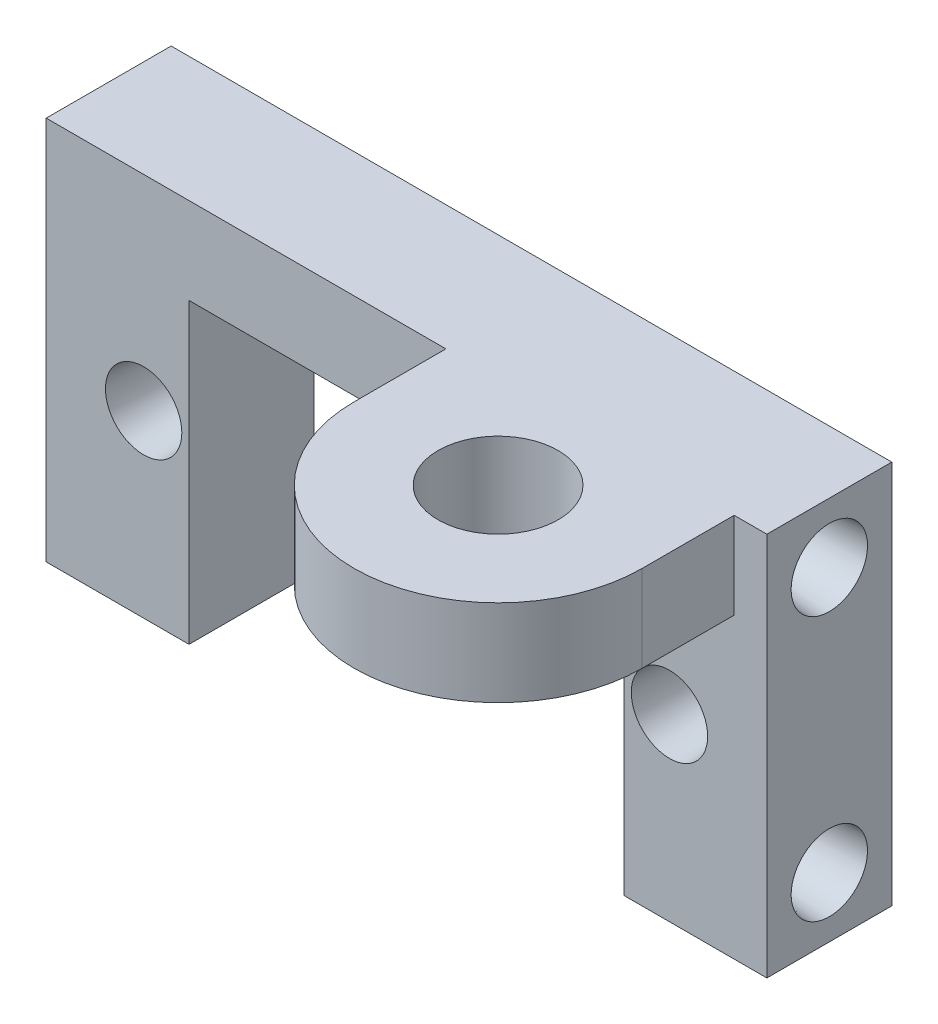
ISO-10303-21;
HEADER;
FILE_DESCRIPTION(('STEP AP214'),'2;1');
FILE_NAME('part.step','',(''),(''),'','','');
FILE_SCHEMA(('AUTOMOTIVE_DESIGN { 1 0 10303 214 1 1 1 1 }'));
ENDSEC;
DATA;
#1=APPLICATION_CONTEXT('core data for automotive mechanical design processes');
#2=APPLICATION_PROTOCOL_DEFINITION('international standard','automotive_design',2000,#1);
#3=PRODUCT_CONTEXT('',#1,'mechanical');
#4=PRODUCT('Part','Part','',(#3));
#5=PRODUCT_RELATED_PRODUCT_CATEGORY('part','',(#4));
#6=PRODUCT_DEFINITION_FORMATION('','',#4);
#7=PRODUCT_DEFINITION_CONTEXT('part definition',#1,'design');
#8=PRODUCT_DEFINITION('design','',#6,#7);
#9=PRODUCT_DEFINITION_SHAPE('','',#8);
#10=(LENGTH_UNIT() NAMED_UNIT(*) SI_UNIT(.MILLI.,.METRE.));
#11=(NAMED_UNIT(*) PLANE_ANGLE_UNIT() SI_UNIT($,.RADIAN.));
#12=(NAMED_UNIT(*) SI_UNIT($,.STERADIAN.) SOLID_ANGLE_UNIT());
#13=UNCERTAINTY_MEASURE_WITH_UNIT(LENGTH_MEASURE(1.E-05),#10,'distance_accuracy_value','');
#14=(GEOMETRIC_REPRESENTATION_CONTEXT(3) GLOBAL_UNCERTAINTY_ASSIGNED_CONTEXT((#13)) GLOBAL_UNIT_ASSIGNED_CONTEXT((#10,
#11,#12)) REPRESENTATION_CONTEXT('',''));
#15=CARTESIAN_POINT('',(0.,0.,0.));
#16=DIRECTION('',(0.,0.,1.));
#17=DIRECTION('',(1.,0.,0.));
#18=AXIS2_PLACEMENT_3D('',#15,#16,#17);
#19=CARTESIAN_POINT('',(0.,0.,6.604));
#20=DIRECTION('',(0.,0.,-1.));
#21=DIRECTION('',(-1.,0.,0.));
#22=AXIS2_PLACEMENT_3D('',#19,#20,#21);
#23=PLANE('',#22);
#24=CARTESIAN_POINT('',(13.9,0.,6.604));
#25=DIRECTION('',(0.,0.,1.));
#26=DIRECTION('',(1.,0.,0.));
#27=AXIS2_PLACEMENT_3D('',#24,#25,#26);
#28=CIRCLE('',#27,2.0193);
#29=CARTESIAN_POINT('',(15.9193,0.,6.604));
#30=VERTEX_POINT('',#29);
#31=EDGE_CURVE('E229',#30,#30,#28,.T.);
#32=ORIENTED_EDGE('',*,*,#31,.F.);
#33=EDGE_LOOP('',(#32));
#34=FACE_BOUND('',#33,.T.);
#35=DIRECTION('',(1.,0.,0.));
#36=VECTOR('',#35,1.);
#37=CARTESIAN_POINT('',(2.08000000000001,6.25,6.604));
#38=LINE('',#37,#36);
#39=CARTESIAN_POINT('',(11.5,6.25,6.604));
#40=VERTEX_POINT('',#39);
#41=CARTESIAN_POINT('',(17.32,6.24999999999999,6.604));
#42=VERTEX_POINT('',#41);
#43=EDGE_CURVE('E11',#40,#42,#38,.T.);
#44=ORIENTED_EDGE('',*,*,#43,.F.);
#45=DIRECTION('',(0.,-1.,0.));
#46=VECTOR('',#45,1.);
#47=CARTESIAN_POINT('',(11.5,6.25,6.604));
#48=LINE('',#47,#46);
#49=CARTESIAN_POINT('',(11.5,-9.498,6.604));
#50=VERTEX_POINT('',#49);
#51=EDGE_CURVE('E169',#40,#50,#48,.T.);
#52=ORIENTED_EDGE('',*,*,#51,.T.);
#53=DIRECTION('',(1.,0.,0.));
#54=VECTOR('',#53,1.);
#55=CARTESIAN_POINT('',(11.5,-9.498,6.604));
#56=LINE('',#55,#54);
#57=CARTESIAN_POINT('',(19.05,-9.498,6.604));
#58=VERTEX_POINT('',#57);
#59=EDGE_CURVE('E171',#50,#58,#56,.T.);
#60=ORIENTED_EDGE('',*,*,#59,.T.);
#61=DIRECTION('',(0.,1.,0.));
#62=VECTOR('',#61,1.);
#63=CARTESIAN_POINT('',(19.05,-9.498,6.604));
#64=LINE('',#63,#62);
#65=CARTESIAN_POINT('',(19.05,10.822,6.604));
#66=VERTEX_POINT('',#65);
#67=EDGE_CURVE('E173',#58,#66,#64,.T.);
#68=ORIENTED_EDGE('',*,*,#67,.T.);
#69=DIRECTION('',(-1.,0.,0.));
#70=VECTOR('',#69,1.);
#71=CARTESIAN_POINT('',(19.05,10.822,6.604));
#72=LINE('',#71,#70);
#73=CARTESIAN_POINT('',(17.32,10.822,6.604));
#74=VERTEX_POINT('',#73);
#75=EDGE_CURVE('E176',#66,#74,#72,.T.);
#76=ORIENTED_EDGE('',*,*,#75,.T.);
#77=DIRECTION('',(0.,1.,0.));
#78=VECTOR('',#77,1.);
#79=CARTESIAN_POINT('',(17.32,-13.4479186717785,6.604));
#80=LINE('',#79,#78);
#81=EDGE_CURVE('E50',#42,#74,#80,.T.);
#82=ORIENTED_EDGE('',*,*,#81,.F.);
#83=EDGE_LOOP('',(#44,#52,#60,#68,#76,#82));
#84=FACE_BOUND('',#83,.T.);
#85=ADVANCED_FACE('F33',(#34,#84),#23,.F.);
#86=CARTESIAN_POINT('',(-11.5,-6.25,6.604));
#87=DIRECTION('',(-1.,0.,0.));
#88=DIRECTION('',(0.,0.,1.));
#89=AXIS2_PLACEMENT_3D('',#86,#87,#88);
#90=PLANE('',#89);
#91=DIRECTION('',(0.,1.,0.));
#92=VECTOR('',#91,1.);
#93=CARTESIAN_POINT('',(-11.5,-6.25,0.));
#94=LINE('',#93,#92);
#95=CARTESIAN_POINT('',(-11.5,-9.498,0.));
#96=VERTEX_POINT('',#95);
#97=CARTESIAN_POINT('',(-11.5,6.25,0.));
#98=VERTEX_POINT('',#97);
#99=EDGE_CURVE('E162',#96,#98,#94,.T.);
#100=ORIENTED_EDGE('',*,*,#99,.T.);
#101=DIRECTION('',(0.,0.,-1.));
#102=VECTOR('',#101,1.);
#103=CARTESIAN_POINT('',(-11.5,6.25,6.604));
#104=LINE('',#103,#102);
#105=CARTESIAN_POINT('',(-11.5,6.25,6.604));
#106=VERTEX_POINT('',#105);
#107=EDGE_CURVE('E42',#106,#98,#104,.T.);
#108=ORIENTED_EDGE('',*,*,#107,.F.);
#109=DIRECTION('',(0.,1.,0.));
#110=VECTOR('',#109,1.);
#111=CARTESIAN_POINT('',(-11.5,-9.498,6.604));
#112=LINE('',#111,#110);
#113=CARTESIAN_POINT('',(-11.5,-9.498,6.604));
#114=VERTEX_POINT('',#113);
#115=EDGE_CURVE('E164',#114,#106,#112,.T.);
#116=ORIENTED_EDGE('',*,*,#115,.F.);
#117=DIRECTION('',(0.,0.,-1.));
#118=VECTOR('',#117,1.);
#119=CARTESIAN_POINT('',(-11.5,-9.498,6.604));
#120=LINE('',#119,#118);
#121=EDGE_CURVE('E182',#114,#96,#120,.T.);
#122=ORIENTED_EDGE('',*,*,#121,.T.);
#123=EDGE_LOOP('',(#100,#108,#116,#122));
#124=FACE_BOUND('',#123,.T.);
#125=ADVANCED_FACE('F35',(#124),#90,.F.);
#126=CARTESIAN_POINT('',(-11.5,6.25,6.604));
#127=DIRECTION('',(0.,1.,0.));
#128=DIRECTION('',(0.,0.,1.));
#129=AXIS2_PLACEMENT_3D('',#126,#127,#128);
#130=PLANE('',#129);
#131=DIRECTION('',(1.,0.,0.));
#132=VECTOR('',#131,1.);
#133=CARTESIAN_POINT('',(-11.5,6.25,0.));
#134=LINE('',#133,#132);
#135=CARTESIAN_POINT('',(11.5,6.25,0.));
#136=VERTEX_POINT('',#135);
#137=EDGE_CURVE('E184',#98,#136,#134,.T.);
#138=ORIENTED_EDGE('',*,*,#137,.T.);
#139=DIRECTION('',(0.,0.,-1.));
#140=VECTOR('',#139,1.);
#141=CARTESIAN_POINT('',(11.5,6.25,6.604));
#142=LINE('',#141,#140);
#143=EDGE_CURVE('E217',#40,#136,#142,.T.);
#144=ORIENTED_EDGE('',*,*,#143,.F.);
#145=ORIENTED_EDGE('',*,*,#43,.T.);
#146=DIRECTION('',(0.,0.,1.));
#147=VECTOR('',#146,1.);
#148=CARTESIAN_POINT('',(17.32,6.25,6.604));
#149=LINE('',#148,#147);
#150=CARTESIAN_POINT('',(17.32,6.25,11.464));
#151=VERTEX_POINT('',#150);
#152=EDGE_CURVE('E163',#42,#151,#149,.T.);
#153=ORIENTED_EDGE('',*,*,#152,.T.);
#154=CARTESIAN_POINT('',(9.70000000000001,6.25,11.464));
#155=DIRECTION('',(0.,1.,0.));
#156=DIRECTION('',(0.,0.,1.));
#157=AXIS2_PLACEMENT_3D('',#154,#155,#156);
#158=CIRCLE('',#157,7.62);
#159=CARTESIAN_POINT('',(2.08000000000001,6.25,11.464));
#160=VERTEX_POINT('',#159);
#161=EDGE_CURVE('E131',#151,#160,#158,.F.);
#162=ORIENTED_EDGE('',*,*,#161,.T.);
#163=DIRECTION('',(0.,0.,-1.));
#164=VECTOR('',#163,1.);
#165=CARTESIAN_POINT('',(2.08000000000001,6.25,11.464));
#166=LINE('',#165,#164);
#167=CARTESIAN_POINT('',(2.08000000000001,6.25,6.604));
#168=VERTEX_POINT('',#167);
#169=EDGE_CURVE('E156',#160,#168,#166,.T.);
#170=ORIENTED_EDGE('',*,*,#169,.T.);
#171=DIRECTION('',(1.,0.,0.));
#172=VECTOR('',#171,1.);
#173=CARTESIAN_POINT('',(-11.5,6.25,6.604));
#174=LINE('',#173,#172);
#175=EDGE_CURVE('E166',#106,#168,#174,.T.);
#176=ORIENTED_EDGE('',*,*,#175,.F.);
#177=ORIENTED_EDGE('',*,*,#107,.T.);
#178=EDGE_LOOP('',(#138,#144,#145,#153,#162,#170,#176,#177));
#179=FACE_BOUND('',#178,.T.);
#180=CARTESIAN_POINT('',(9.70000000000001,6.25,11.464));
#181=DIRECTION('',(0.,1.,0.));
#182=DIRECTION('',(0.,0.,1.));
#183=AXIS2_PLACEMENT_3D('',#180,#181,#182);
#184=CIRCLE('',#183,3.175);
#185=CARTESIAN_POINT('',(6.52500000000001,6.25,11.464));
#186=VERTEX_POINT('',#185);
#187=EDGE_CURVE('E159',#186,#186,#184,.F.);
#188=ORIENTED_EDGE('',*,*,#187,.F.);
#189=EDGE_LOOP('',(#188));
#190=FACE_BOUND('',#189,.T.);
#191=ADVANCED_FACE('F248',(#179,#190),#130,.F.);
#192=CARTESIAN_POINT('',(11.5,-6.25,6.604));
#193=DIRECTION('',(1.,0.,0.));
#194=DIRECTION('',(0.,0.,-1.));
#195=AXIS2_PLACEMENT_3D('',#192,#193,#194);
#196=PLANE('',#195);
#197=DIRECTION('',(0.,-1.,0.));
#198=VECTOR('',#197,1.);
#199=CARTESIAN_POINT('',(11.5,-6.25,0.));
#200=LINE('',#199,#198);
#201=CARTESIAN_POINT('',(11.5,-9.498,0.));
#202=VERTEX_POINT('',#201);
#203=EDGE_CURVE('E187',#136,#202,#200,.T.);
#204=ORIENTED_EDGE('',*,*,#203,.T.);
#205=DIRECTION('',(0.,0.,-1.));
#206=VECTOR('',#205,1.);
#207=CARTESIAN_POINT('',(11.5,-9.498,6.604));
#208=LINE('',#207,#206);
#209=EDGE_CURVE('E214',#50,#202,#208,.T.);
#210=ORIENTED_EDGE('',*,*,#209,.F.);
#211=ORIENTED_EDGE('',*,*,#51,.F.);
#212=ORIENTED_EDGE('',*,*,#143,.T.);
#213=EDGE_LOOP('',(#204,#210,#211,#212));
#214=FACE_BOUND('',#213,.T.);
#215=ADVANCED_FACE('F294',(#214),#196,.F.);
#216=CARTESIAN_POINT('',(11.5,-9.498,6.604));
#217=DIRECTION('',(0.,1.,0.));
#218=DIRECTION('',(0.,0.,1.));
#219=AXIS2_PLACEMENT_3D('',#216,#217,#218);
#220=PLANE('',#219);
#221=DIRECTION('',(1.,0.,0.));
#222=VECTOR('',#221,1.);
#223=CARTESIAN_POINT('',(11.5,-9.498,0.));
#224=LINE('',#223,#222);
#225=CARTESIAN_POINT('',(19.05,-9.498,0.));
#226=VERTEX_POINT('',#225);
#227=EDGE_CURVE('E189',#202,#226,#224,.T.);
#228=ORIENTED_EDGE('',*,*,#227,.T.);
#229=DIRECTION('',(0.,0.,-1.));
#230=VECTOR('',#229,1.);
#231=CARTESIAN_POINT('',(19.05,-9.498,6.604));
#232=LINE('',#231,#230);
#233=EDGE_CURVE('E211',#58,#226,#232,.T.);
#234=ORIENTED_EDGE('',*,*,#233,.F.);
#235=ORIENTED_EDGE('',*,*,#59,.F.);
#236=ORIENTED_EDGE('',*,*,#209,.T.);
#237=EDGE_LOOP('',(#228,#234,#235,#236));
#238=FACE_BOUND('',#237,.T.);
#239=ADVANCED_FACE('F298',(#238),#220,.F.);
#240=CARTESIAN_POINT('',(19.05,-6.25,6.604));
#241=DIRECTION('',(-1.,0.,0.));
#242=DIRECTION('',(0.,-1.,0.));
#243=AXIS2_PLACEMENT_3D('',#240,#241,#242);
#244=PLANE('',#243);
#245=CARTESIAN_POINT('',(19.05,7.64699999999999,3.302));
#246=DIRECTION('',(1.,0.,0.));
#247=DIRECTION('',(0.,1.,0.));
#248=AXIS2_PLACEMENT_3D('',#245,#246,#247);
#249=CIRCLE('',#248,2.0193);
#250=CARTESIAN_POINT('',(19.05,9.66629999999999,3.302));
#251=VERTEX_POINT('',#250);
#252=EDGE_CURVE('E488',#251,#251,#249,.T.);
#253=ORIENTED_EDGE('',*,*,#252,.F.);
#254=EDGE_LOOP('',(#253));
#255=FACE_BOUND('',#254,.T.);
#256=CARTESIAN_POINT('',(19.05,-6.32300000000001,3.302));
#257=DIRECTION('',(1.,0.,0.));
#258=DIRECTION('',(0.,1.,0.));
#259=AXIS2_PLACEMENT_3D('',#256,#257,#258);
#260=CIRCLE('',#259,2.0193);
#261=CARTESIAN_POINT('',(19.05,-4.30370000000001,3.302));
#262=VERTEX_POINT('',#261);
#263=EDGE_CURVE('E499',#262,#262,#260,.T.);
#264=ORIENTED_EDGE('',*,*,#263,.F.);
#265=EDGE_LOOP('',(#264));
#266=FACE_BOUND('',#265,.T.);
#267=DIRECTION('',(0.,1.,0.));
#268=VECTOR('',#267,1.);
#269=CARTESIAN_POINT('',(19.05,-6.25,0.));
#270=LINE('',#269,#268);
#271=CARTESIAN_POINT('',(19.05,10.822,0.));
#272=VERTEX_POINT('',#271);
#273=EDGE_CURVE('E192',#226,#272,#270,.T.);
#274=ORIENTED_EDGE('',*,*,#273,.T.);
#275=DIRECTION('',(0.,0.,-1.));
#276=VECTOR('',#275,1.);
#277=CARTESIAN_POINT('',(19.05,10.822,6.604));
#278=LINE('',#277,#276);
#279=EDGE_CURVE('E208',#66,#272,#278,.T.);
#280=ORIENTED_EDGE('',*,*,#279,.F.);
#281=ORIENTED_EDGE('',*,*,#67,.F.);
#282=ORIENTED_EDGE('',*,*,#233,.T.);
#283=EDGE_LOOP('',(#274,#280,#281,#282));
#284=FACE_BOUND('',#283,.T.);
#285=ADVANCED_FACE('F303',(#255,#266,#284),#244,.F.);
#286=CARTESIAN_POINT('',(19.05,10.822,6.604));
#287=DIRECTION('',(0.,-1.,0.));
#288=DIRECTION('',(0.,0.,-1.));
#289=AXIS2_PLACEMENT_3D('',#286,#287,#288);
#290=PLANE('',#289);
#291=DIRECTION('',(-1.,0.,0.));
#292=VECTOR('',#291,1.);
#293=CARTESIAN_POINT('',(19.05,10.822,0.));
#294=LINE('',#293,#292);
#295=CARTESIAN_POINT('',(-19.05,10.822,0.));
#296=VERTEX_POINT('',#295);
#297=EDGE_CURVE('E194',#272,#296,#294,.T.);
#298=ORIENTED_EDGE('',*,*,#297,.T.);
#299=DIRECTION('',(0.,0.,-1.));
#300=VECTOR('',#299,1.);
#301=CARTESIAN_POINT('',(-19.05,10.822,6.604));
#302=LINE('',#301,#300);
#303=CARTESIAN_POINT('',(-19.05,10.822,6.604));
#304=VERTEX_POINT('',#303);
#305=EDGE_CURVE('E205',#304,#296,#302,.T.);
#306=ORIENTED_EDGE('',*,*,#305,.F.);
#307=CARTESIAN_POINT('',(2.08000000000001,10.822,6.604));
#308=VERTEX_POINT('',#307);
#309=EDGE_CURVE('E175',#308,#304,#72,.T.);
#310=ORIENTED_EDGE('',*,*,#309,.F.);
#311=DIRECTION('',(0.,0.,1.));
#312=VECTOR('',#311,1.);
#313=CARTESIAN_POINT('',(2.08000000000001,10.822,11.464));
#314=LINE('',#313,#312);
#315=CARTESIAN_POINT('',(2.08000000000001,10.822,11.464));
#316=VERTEX_POINT('',#315);
#317=EDGE_CURVE('E134',#308,#316,#314,.T.);
#318=ORIENTED_EDGE('',*,*,#317,.T.);
#319=CARTESIAN_POINT('',(9.70000000000001,10.822,11.464));
#320=DIRECTION('',(0.,1.,0.));
#321=DIRECTION('',(-1.,0.,0.));
#322=AXIS2_PLACEMENT_3D('',#319,#320,#321);
#323=CIRCLE('',#322,7.62);
#324=CARTESIAN_POINT('',(17.32,10.822,11.464));
#325=VERTEX_POINT('',#324);
#326=EDGE_CURVE('E129',#316,#325,#323,.T.);
#327=ORIENTED_EDGE('',*,*,#326,.T.);
#328=DIRECTION('',(0.,0.,-1.));
#329=VECTOR('',#328,1.);
#330=CARTESIAN_POINT('',(17.32,10.822,6.604));
#331=LINE('',#330,#329);
#332=EDGE_CURVE('E137',#325,#74,#331,.T.);
#333=ORIENTED_EDGE('',*,*,#332,.T.);
#334=ORIENTED_EDGE('',*,*,#75,.F.);
#335=ORIENTED_EDGE('',*,*,#279,.T.);
#336=EDGE_LOOP('',(#298,#306,#310,#318,#327,#333,#334,#335));
#337=FACE_BOUND('',#336,.T.);
#338=CARTESIAN_POINT('',(9.70000000000001,10.822,11.464));
#339=DIRECTION('',(0.,1.,0.));
#340=DIRECTION('',(-1.,0.,0.));
#341=AXIS2_PLACEMENT_3D('',#338,#339,#340);
#342=CIRCLE('',#341,3.175);
#343=CARTESIAN_POINT('',(6.52500000000001,10.822,11.464));
#344=VERTEX_POINT('',#343);
#345=EDGE_CURVE('E146',#344,#344,#342,.T.);
#346=ORIENTED_EDGE('',*,*,#345,.F.);
#347=EDGE_LOOP('',(#346));
#348=FACE_BOUND('',#347,.T.);
#349=ADVANCED_FACE('F143',(#337,#348),#290,.F.);
#350=CARTESIAN_POINT('',(-19.05,-6.25,6.604));
#351=DIRECTION('',(1.,0.,0.));
#352=DIRECTION('',(0.,0.,-1.));
#353=AXIS2_PLACEMENT_3D('',#350,#351,#352);
#354=PLANE('',#353);
#355=DIRECTION('',(0.,-1.,0.));
#356=VECTOR('',#355,1.);
#357=CARTESIAN_POINT('',(-19.05,-6.25,0.));
#358=LINE('',#357,#356);
#359=CARTESIAN_POINT('',(-19.05,-9.498,0.));
#360=VERTEX_POINT('',#359);
#361=EDGE_CURVE('E196',#296,#360,#358,.T.);
#362=ORIENTED_EDGE('',*,*,#361,.T.);
#363=DIRECTION('',(0.,0.,-1.));
#364=VECTOR('',#363,1.);
#365=CARTESIAN_POINT('',(-19.05,-9.498,6.604));
#366=LINE('',#365,#364);
#367=CARTESIAN_POINT('',(-19.05,-9.498,6.604));
#368=VERTEX_POINT('',#367);
#369=EDGE_CURVE('E202',#368,#360,#366,.T.);
#370=ORIENTED_EDGE('',*,*,#369,.F.);
#371=DIRECTION('',(0.,-1.,0.));
#372=VECTOR('',#371,1.);
#373=CARTESIAN_POINT('',(-19.05,10.822,6.604));
#374=LINE('',#373,#372);
#375=EDGE_CURVE('E178',#304,#368,#374,.T.);
#376=ORIENTED_EDGE('',*,*,#375,.F.);
#377=ORIENTED_EDGE('',*,*,#305,.T.);
#378=EDGE_LOOP('',(#362,#370,#376,#377));
#379=FACE_BOUND('',#378,.T.);
#380=ADVANCED_FACE('F282',(#379),#354,.F.);
#381=CARTESIAN_POINT('',(-19.05,-9.498,6.604));
#382=DIRECTION('',(0.,1.,0.));
#383=DIRECTION('',(0.,0.,1.));
#384=AXIS2_PLACEMENT_3D('',#381,#382,#383);
#385=PLANE('',#384);
#386=DIRECTION('',(1.,0.,0.));
#387=VECTOR('',#386,1.);
#388=CARTESIAN_POINT('',(-19.05,-9.498,0.));
#389=LINE('',#388,#387);
#390=EDGE_CURVE('E167',#360,#96,#389,.T.);
#391=ORIENTED_EDGE('',*,*,#390,.T.);
#392=ORIENTED_EDGE('',*,*,#121,.F.);
#393=DIRECTION('',(1.,0.,0.));
#394=VECTOR('',#393,1.);
#395=CARTESIAN_POINT('',(-19.05,-9.498,6.604));
#396=LINE('',#395,#394);
#397=EDGE_CURVE('E180',#368,#114,#396,.T.);
#398=ORIENTED_EDGE('',*,*,#397,.F.);
#399=ORIENTED_EDGE('',*,*,#369,.T.);
#400=EDGE_LOOP('',(#391,#392,#398,#399));
#401=FACE_BOUND('',#400,.T.);
#402=ADVANCED_FACE('F275',(#401),#385,.F.);
#403=CARTESIAN_POINT('',(-13.9,0.,6.604));
#404=DIRECTION('',(0.,0.,1.));
#405=DIRECTION('',(1.,0.,0.));
#406=AXIS2_PLACEMENT_3D('',#403,#404,#405);
#407=CIRCLE('',#406,2.0193);
#408=CARTESIAN_POINT('',(-11.8807,0.,6.604));
#409=VERTEX_POINT('',#408);
#410=EDGE_CURVE('E223',#409,#409,#407,.T.);
#411=ORIENTED_EDGE('',*,*,#410,.F.);
#412=EDGE_LOOP('',(#411));
#413=FACE_BOUND('',#412,.T.);
#414=ORIENTED_EDGE('',*,*,#175,.T.);
#415=DIRECTION('',(0.,1.,0.));
#416=VECTOR('',#415,1.);
#417=CARTESIAN_POINT('',(2.08000000000001,-13.4479186717785,6.604));
#418=LINE('',#417,#416);
#419=EDGE_CURVE('E57',#168,#308,#418,.T.);
#420=ORIENTED_EDGE('',*,*,#419,.T.);
#421=ORIENTED_EDGE('',*,*,#309,.T.);
#422=ORIENTED_EDGE('',*,*,#375,.T.);
#423=ORIENTED_EDGE('',*,*,#397,.T.);
#424=ORIENTED_EDGE('',*,*,#115,.T.);
#425=EDGE_LOOP('',(#414,#420,#421,#422,#423,#424));
#426=FACE_BOUND('',#425,.T.);
#427=ADVANCED_FACE('F267',(#413,#426),#23,.F.);
#428=CARTESIAN_POINT('',(0.,0.,0.));
#429=DIRECTION('',(0.,0.,-1.));
#430=DIRECTION('',(-1.,0.,0.));
#431=AXIS2_PLACEMENT_3D('',#428,#429,#430);
#432=PLANE('',#431);
#433=CARTESIAN_POINT('',(-13.9,0.,0.));
#434=DIRECTION('',(0.,0.,-1.));
#435=DIRECTION('',(-1.,0.,0.));
#436=AXIS2_PLACEMENT_3D('',#433,#434,#435);
#437=CIRCLE('',#436,1.7907);
#438=CARTESIAN_POINT('',(-15.6907,0.,0.));
#439=VERTEX_POINT('',#438);
#440=EDGE_CURVE('E149',#439,#439,#437,.T.);
#441=ORIENTED_EDGE('',*,*,#440,.F.);
#442=EDGE_LOOP('',(#441));
#443=FACE_BOUND('',#442,.T.);
#444=CARTESIAN_POINT('',(13.9,0.,0.));
#445=DIRECTION('',(0.,0.,-1.));
#446=DIRECTION('',(-1.,0.,0.));
#447=AXIS2_PLACEMENT_3D('',#444,#445,#446);
#448=CIRCLE('',#447,1.7907);
#449=CARTESIAN_POINT('',(12.1093,0.,0.));
#450=VERTEX_POINT('',#449);
#451=EDGE_CURVE('E227',#450,#450,#448,.T.);
#452=ORIENTED_EDGE('',*,*,#451,.F.);
#453=EDGE_LOOP('',(#452));
#454=FACE_BOUND('',#453,.T.);
#455=ORIENTED_EDGE('',*,*,#99,.F.);
#456=ORIENTED_EDGE('',*,*,#390,.F.);
#457=ORIENTED_EDGE('',*,*,#361,.F.);
#458=ORIENTED_EDGE('',*,*,#297,.F.);
#459=ORIENTED_EDGE('',*,*,#273,.F.);
#460=ORIENTED_EDGE('',*,*,#227,.F.);
#461=ORIENTED_EDGE('',*,*,#203,.F.);
#462=ORIENTED_EDGE('',*,*,#137,.F.);
#463=EDGE_LOOP('',(#455,#456,#457,#458,#459,#460,#461,#462));
#464=FACE_BOUND('',#463,.T.);
#465=ADVANCED_FACE('F261',(#443,#454,#464),#432,.T.);
#466=CARTESIAN_POINT('',(17.32,-13.4479186717785,6.604));
#467=DIRECTION('',(1.,0.,0.));
#468=DIRECTION('',(0.,1.,0.));
#469=AXIS2_PLACEMENT_3D('',#466,#467,#468);
#470=PLANE('',#469);
#471=ORIENTED_EDGE('',*,*,#152,.F.);
#472=ORIENTED_EDGE('',*,*,#81,.T.);
#473=ORIENTED_EDGE('',*,*,#332,.F.);
#474=DIRECTION('',(0.,1.,0.));
#475=VECTOR('',#474,1.);
#476=CARTESIAN_POINT('',(17.32,-13.4479186717785,11.464));
#477=LINE('',#476,#475);
#478=EDGE_CURVE('E124',#151,#325,#477,.T.);
#479=ORIENTED_EDGE('',*,*,#478,.F.);
#480=EDGE_LOOP('',(#471,#472,#473,#479));
#481=FACE_BOUND('',#480,.T.);
#482=ADVANCED_FACE('F138',(#481),#470,.T.);
#483=CARTESIAN_POINT('',(2.08000000000001,-13.4479186717785,11.464));
#484=DIRECTION('',(-1.,0.,0.));
#485=DIRECTION('',(0.,-1.,0.));
#486=AXIS2_PLACEMENT_3D('',#483,#484,#485);
#487=PLANE('',#486);
#488=ORIENTED_EDGE('',*,*,#169,.F.);
#489=DIRECTION('',(0.,1.,0.));
#490=VECTOR('',#489,1.);
#491=CARTESIAN_POINT('',(2.08000000000001,-13.4479186717785,11.464));
#492=LINE('',#491,#490);
#493=EDGE_CURVE('E154',#160,#316,#492,.T.);
#494=ORIENTED_EDGE('',*,*,#493,.T.);
#495=ORIENTED_EDGE('',*,*,#317,.F.);
#496=ORIENTED_EDGE('',*,*,#419,.F.);
#497=EDGE_LOOP('',(#488,#494,#495,#496));
#498=FACE_BOUND('',#497,.T.);
#499=ADVANCED_FACE('F252',(#498),#487,.T.);
#500=CARTESIAN_POINT('',(9.70000000000001,-13.4479186717785,11.464));
#501=DIRECTION('',(0.,1.,0.));
#502=DIRECTION('',(-1.,0.,0.));
#503=AXIS2_PLACEMENT_3D('',#500,#501,#502);
#504=CYLINDRICAL_SURFACE('',#503,7.62);
#505=ORIENTED_EDGE('',*,*,#161,.F.);
#506=ORIENTED_EDGE('',*,*,#478,.T.);
#507=ORIENTED_EDGE('',*,*,#326,.F.);
#508=ORIENTED_EDGE('',*,*,#493,.F.);
#509=EDGE_LOOP('',(#505,#506,#507,#508));
#510=FACE_BOUND('',#509,.T.);
#511=ADVANCED_FACE('F126',(#510),#504,.T.);
#512=CARTESIAN_POINT('',(9.70000000000001,-13.4479186717785,11.464));
#513=DIRECTION('',(0.,1.,0.));
#514=DIRECTION('',(-1.,0.,0.));
#515=AXIS2_PLACEMENT_3D('',#512,#513,#514);
#516=CYLINDRICAL_SURFACE('',#515,3.175);
#517=CARTESIAN_POINT('',(6.52500000000001,6.25,11.464));
#518=CARTESIAN_POINT('',(6.52500000000001,6.297625,11.464));
#519=CARTESIAN_POINT('',(6.52500000000001,6.34525,11.464));
#520=CARTESIAN_POINT('',(6.52500000000001,6.4405,11.464));
#521=CARTESIAN_POINT('',(6.52500000000001,6.488125,11.464));
#522=CARTESIAN_POINT('',(6.52500000000001,6.583375,11.464));
#523=CARTESIAN_POINT('',(6.52500000000001,6.631,11.464));
#524=CARTESIAN_POINT('',(6.52500000000001,6.72624999999999,11.464));
#525=CARTESIAN_POINT('',(6.52500000000001,6.773875,11.464));
#526=CARTESIAN_POINT('',(6.52500000000001,6.869125,11.464));
#527=CARTESIAN_POINT('',(6.52500000000001,6.91675,11.464));
#528=CARTESIAN_POINT('',(6.52500000000001,7.012,11.464));
#529=CARTESIAN_POINT('',(6.52500000000001,7.059625,11.464));
#530=CARTESIAN_POINT('',(6.52500000000001,7.154875,11.464));
#531=CARTESIAN_POINT('',(6.52500000000001,7.2025,11.464));
#532=CARTESIAN_POINT('',(6.52500000000001,7.29775,11.464));
#533=CARTESIAN_POINT('',(6.52500000000001,7.345375,11.464));
#534=CARTESIAN_POINT('',(6.52500000000001,7.440625,11.464));
#535=CARTESIAN_POINT('',(6.52500000000001,7.48825,11.464));
#536=CARTESIAN_POINT('',(6.52500000000001,7.5835,11.464));
#537=CARTESIAN_POINT('',(6.52500000000001,7.631125,11.464));
#538=CARTESIAN_POINT('',(6.52500000000001,7.726375,11.464));
#539=CARTESIAN_POINT('',(6.52500000000001,7.774,11.464));
#540=CARTESIAN_POINT('',(6.52500000000001,7.86925,11.464));
#541=CARTESIAN_POINT('',(6.52500000000001,7.916875,11.464));
#542=CARTESIAN_POINT('',(6.52500000000001,8.012125,11.464));
#543=CARTESIAN_POINT('',(6.52500000000001,8.05975,11.464));
#544=CARTESIAN_POINT('',(6.52500000000001,8.155,11.464));
#545=CARTESIAN_POINT('',(6.52500000000001,8.202625,11.464));
#546=CARTESIAN_POINT('',(6.52500000000001,8.297875,11.464));
#547=CARTESIAN_POINT('',(6.52500000000001,8.3455,11.464));
#548=CARTESIAN_POINT('',(6.52500000000001,8.44075,11.464));
#549=CARTESIAN_POINT('',(6.52500000000001,8.488375,11.464));
#550=CARTESIAN_POINT('',(6.52500000000001,8.583625,11.464));
#551=CARTESIAN_POINT('',(6.52500000000001,8.63125,11.464));
#552=CARTESIAN_POINT('',(6.52500000000001,8.7265,11.464));
#553=CARTESIAN_POINT('',(6.52500000000001,8.774125,11.464));
#554=CARTESIAN_POINT('',(6.52500000000001,8.869375,11.464));
#555=CARTESIAN_POINT('',(6.52500000000001,8.917,11.464));
#556=CARTESIAN_POINT('',(6.52500000000001,9.01225,11.464));
#557=CARTESIAN_POINT('',(6.52500000000001,9.05987499999999,11.464));
#558=CARTESIAN_POINT('',(6.52500000000001,9.155125,11.464));
#559=CARTESIAN_POINT('',(6.52500000000001,9.20275,11.464));
#560=CARTESIAN_POINT('',(6.52500000000001,9.298,11.464));
#561=CARTESIAN_POINT('',(6.52500000000001,9.345625,11.464));
#562=CARTESIAN_POINT('',(6.52500000000001,9.440875,11.464));
#563=CARTESIAN_POINT('',(6.52500000000001,9.4885,11.464));
#564=CARTESIAN_POINT('',(6.52500000000001,9.58375,11.464));
#565=CARTESIAN_POINT('',(6.52500000000001,9.631375,11.464));
#566=CARTESIAN_POINT('',(6.52500000000001,9.726625,11.464));
#567=CARTESIAN_POINT('',(6.52500000000001,9.77425,11.464));
#568=CARTESIAN_POINT('',(6.52500000000001,9.8695,11.464));
#569=CARTESIAN_POINT('',(6.52500000000001,9.917125,11.464));
#570=CARTESIAN_POINT('',(6.52500000000001,10.012375,11.464));
#571=CARTESIAN_POINT('',(6.52500000000001,10.06,11.464));
#572=CARTESIAN_POINT('',(6.52500000000001,10.15525,11.464));
#573=CARTESIAN_POINT('',(6.52500000000001,10.202875,11.464));
#574=CARTESIAN_POINT('',(6.52500000000001,10.298125,11.464));
#575=CARTESIAN_POINT('',(6.52500000000001,10.34575,11.464));
#576=CARTESIAN_POINT('',(6.52500000000001,10.441,11.464));
#577=CARTESIAN_POINT('',(6.52500000000001,10.488625,11.464));
#578=CARTESIAN_POINT('',(6.52500000000001,10.583875,11.464));
#579=CARTESIAN_POINT('',(6.52500000000001,10.6315,11.464));
#580=CARTESIAN_POINT('',(6.52500000000001,10.72675,11.464));
#581=CARTESIAN_POINT('',(6.52500000000001,10.774375,11.464));
#582=CARTESIAN_POINT('',(6.52500000000001,10.822,11.464));
#583=B_SPLINE_CURVE_WITH_KNOTS('',3,(#517,#518,#519,#520,#521,#522,#523,#524,#525,#526,#527,
#528,#529,#530,#531,#532,#533,#534,#535,#536,#537,#538,#539,#540,#541,#542,#543,#544,#545,#546,
#547,#548,#549,#550,#551,#552,#553,#554,#555,#556,#557,#558,#559,#560,#561,#562,#563,#564,#565,
#566,#567,#568,#569,#570,#571,#572,#573,#574,#575,#576,#577,#578,#579,#580,#581,#582),
.UNSPECIFIED.,.F.,.F.,(4,2,2,2,2,2,2,2,2,2,2,2,2,2,2,2,2,2,2,2,2,2,2,2,2,2,2,2,2,2,2,2,4),(0.,
0.142875000000001,0.285750000000001,0.428624999999998,0.571499999999999,0.714375,0.85725,
1.000125,1.143,1.285875,1.42875,1.571625,1.7145,1.857375,2.00025,2.143125,2.286,2.428875,
2.57175,2.714625,2.8575,3.000375,3.14325,3.286125,3.429,3.571875,3.71475,3.857625,4.0005,
4.143375,4.28625,4.429125,4.572),.UNSPECIFIED.);
#584=EDGE_CURVE('BSEAM259',#186,#344,#583,.T.);
#585=ORIENTED_EDGE('',*,*,#187,.T.);
#586=ORIENTED_EDGE('',*,*,#345,.T.);
#587=ORIENTED_EDGE('',*,*,#584,.T.);
#588=ORIENTED_EDGE('',*,*,#584,.F.);
#589=EDGE_LOOP('',(#585,#587,#586,#588));
#590=FACE_BOUND('',#589,.T.);
#591=ADVANCED_FACE('F259',(#590),#516,.F.);
#592=CARTESIAN_POINT('',(13.9,0.,19.084));
#593=DIRECTION('',(0.,0.,-1.));
#594=DIRECTION('',(-1.,0.,0.));
#595=AXIS2_PLACEMENT_3D('',#592,#593,#594);
#596=CYLINDRICAL_SURFACE('',#595,1.7907);
#597=CARTESIAN_POINT('',(13.9,0.,3.33486769371567));
#598=DIRECTION('',(0.,0.,1.));
#599=DIRECTION('',(1.,0.,0.));
#600=AXIS2_PLACEMENT_3D('',#597,#598,#599);
#601=CIRCLE('',#600,1.7907);
#602=CARTESIAN_POINT('',(15.6907,0.,3.33486769371567));
#603=VERTEX_POINT('',#602);
#604=EDGE_CURVE('E37',#603,#603,#601,.T.);
#605=ORIENTED_EDGE('',*,*,#604,.T.);
#606=EDGE_LOOP('',(#605));
#607=FACE_BOUND('',#606,.T.);
#608=ORIENTED_EDGE('',*,*,#451,.T.);
#609=EDGE_LOOP('',(#608));
#610=FACE_BOUND('',#609,.T.);
#611=ADVANCED_FACE('F374',(#607,#610),#596,.F.);
#612=CARTESIAN_POINT('',(-13.9,0.,19.084));
#613=DIRECTION('',(0.,0.,-1.));
#614=DIRECTION('',(-1.,0.,0.));
#615=AXIS2_PLACEMENT_3D('',#612,#613,#614);
#616=CYLINDRICAL_SURFACE('',#615,1.7907);
#617=CARTESIAN_POINT('',(-13.9,0.,3.33486769371566));
#618=DIRECTION('',(0.,0.,1.));
#619=DIRECTION('',(1.,0.,0.));
#620=AXIS2_PLACEMENT_3D('',#617,#618,#619);
#621=CIRCLE('',#620,1.7907);
#622=CARTESIAN_POINT('',(-12.1093,0.,3.33486769371566));
#623=VERTEX_POINT('',#622);
#624=EDGE_CURVE('E221',#623,#623,#621,.T.);
#625=ORIENTED_EDGE('',*,*,#624,.T.);
#626=EDGE_LOOP('',(#625));
#627=FACE_BOUND('',#626,.T.);
#628=ORIENTED_EDGE('',*,*,#440,.T.);
#629=EDGE_LOOP('',(#628));
#630=FACE_BOUND('',#629,.T.);
#631=ADVANCED_FACE('F398',(#627,#630),#616,.F.);
#632=CARTESIAN_POINT('',(-13.9,0.,6.604));
#633=DIRECTION('',(0.,0.,1.));
#634=DIRECTION('',(1.,0.,0.));
#635=AXIS2_PLACEMENT_3D('',#632,#633,#634);
#636=CONICAL_SURFACE('',#635,2.0193,0.0698131700797733);
#637=ORIENTED_EDGE('',*,*,#410,.T.);
#638=EDGE_LOOP('',(#637));
#639=FACE_BOUND('',#638,.T.);
#640=ORIENTED_EDGE('',*,*,#624,.F.);
#641=EDGE_LOOP('',(#640));
#642=FACE_BOUND('',#641,.T.);
#643=ADVANCED_FACE('F408',(#639,#642),#636,.F.);
#644=CARTESIAN_POINT('',(13.9,0.,6.604));
#645=DIRECTION('',(0.,0.,1.));
#646=DIRECTION('',(1.,0.,0.));
#647=AXIS2_PLACEMENT_3D('',#644,#645,#646);
#648=CONICAL_SURFACE('',#647,2.0193,0.0698131700797733);
#649=ORIENTED_EDGE('',*,*,#31,.T.);
#650=EDGE_LOOP('',(#649));
#651=FACE_BOUND('',#650,.T.);
#652=ORIENTED_EDGE('',*,*,#604,.F.);
#653=EDGE_LOOP('',(#652));
#654=FACE_BOUND('',#653,.T.);
#655=ADVANCED_FACE('F417',(#651,#654),#648,.F.);
#656=CARTESIAN_POINT('',(19.05,7.64699999999999,3.302));
#657=DIRECTION('',(1.,0.,0.));
#658=DIRECTION('',(0.,1.,0.));
#659=AXIS2_PLACEMENT_3D('',#656,#657,#658);
#660=CONICAL_SURFACE('',#659,2.0193,0.0698131700797733);
#661=ORIENTED_EDGE('',*,*,#252,.T.);
#662=EDGE_LOOP('',(#661));
#663=FACE_BOUND('',#662,.T.);
#664=CARTESIAN_POINT('',(15.7808676937157,7.64699999999999,3.302));
#665=DIRECTION('',(1.,0.,0.));
#666=DIRECTION('',(0.,1.,0.));
#667=AXIS2_PLACEMENT_3D('',#664,#665,#666);
#668=CIRCLE('',#667,1.7907);
#669=CARTESIAN_POINT('',(15.7808676937157,9.43769999999999,3.302));
#670=VERTEX_POINT('',#669);
#671=EDGE_CURVE('E491',#670,#670,#668,.F.);
#672=ORIENTED_EDGE('',*,*,#671,.T.);
#673=EDGE_LOOP('',(#672));
#674=FACE_BOUND('',#673,.T.);
#675=ADVANCED_FACE('F426',(#663,#674),#660,.F.);
#676=CARTESIAN_POINT('',(19.05,-6.32300000000001,3.302));
#677=DIRECTION('',(1.,0.,0.));
#678=DIRECTION('',(0.,1.,0.));
#679=AXIS2_PLACEMENT_3D('',#676,#677,#678);
#680=CONICAL_SURFACE('',#679,2.0193,0.0698131700797733);
#681=ORIENTED_EDGE('',*,*,#263,.T.);
#682=EDGE_LOOP('',(#681));
#683=FACE_BOUND('',#682,.T.);
#684=CARTESIAN_POINT('',(15.7808676937157,-6.32300000000001,3.302));
#685=DIRECTION('',(1.,0.,0.));
#686=DIRECTION('',(0.,1.,0.));
#687=AXIS2_PLACEMENT_3D('',#684,#685,#686);
#688=CIRCLE('',#687,1.7907);
#689=CARTESIAN_POINT('',(15.7808676937157,-4.53230000000001,3.302));
#690=VERTEX_POINT('',#689);
#691=EDGE_CURVE('E494',#690,#690,#688,.F.);
#692=ORIENTED_EDGE('',*,*,#691,.T.);
#693=EDGE_LOOP('',(#692));
#694=FACE_BOUND('',#693,.T.);
#695=ADVANCED_FACE('F452',(#683,#694),#680,.F.);
#696=CARTESIAN_POINT('',(12.446,7.647,3.302));
#697=DIRECTION('',(1.,0.,0.));
#698=DIRECTION('',(0.,1.,0.));
#699=AXIS2_PLACEMENT_3D('',#696,#697,#698);
#700=PLANE('',#699);
#701=CARTESIAN_POINT('',(12.446,7.647,3.302));
#702=DIRECTION('',(1.,0.,0.));
#703=DIRECTION('',(0.,1.,0.));
#704=AXIS2_PLACEMENT_3D('',#701,#702,#703);
#705=CIRCLE('',#704,1.7907);
#706=CARTESIAN_POINT('',(12.446,9.43769999999999,3.302));
#707=VERTEX_POINT('',#706);
#708=EDGE_CURVE('E234',#707,#707,#705,.T.);
#709=ORIENTED_EDGE('',*,*,#708,.T.);
#710=EDGE_LOOP('',(#709));
#711=FACE_BOUND('',#710,.T.);
#712=ADVANCED_FACE('F448',(#711),#700,.T.);
#713=CARTESIAN_POINT('',(12.446,7.647,3.302));
#714=DIRECTION('',(1.,0.,0.));
#715=DIRECTION('',(0.,1.,0.));
#716=AXIS2_PLACEMENT_3D('',#713,#714,#715);
#717=CYLINDRICAL_SURFACE('',#716,1.7907);
#718=CARTESIAN_POINT('',(15.7808676937157,9.43769999999999,3.302));
#719=CARTESIAN_POINT('',(15.7461294885728,9.43769999999999,3.302));
#720=CARTESIAN_POINT('',(15.7113912834299,9.43769999999999,3.302));
#721=CARTESIAN_POINT('',(15.6419148731442,9.43769999999999,3.302));
#722=CARTESIAN_POINT('',(15.6071766680013,9.43769999999999,3.302));
#723=CARTESIAN_POINT('',(15.5377002577156,9.43769999999999,3.302));
#724=CARTESIAN_POINT('',(15.5029620525727,9.43769999999999,3.302));
#725=CARTESIAN_POINT('',(15.4334856422869,9.43769999999999,3.302));
#726=CARTESIAN_POINT('',(15.3987474371441,9.43769999999999,3.302));
#727=CARTESIAN_POINT('',(15.3292710268583,9.43769999999999,3.302));
#728=CARTESIAN_POINT('',(15.2945328217155,9.43769999999999,3.302));
#729=CARTESIAN_POINT('',(15.2250564114297,9.43769999999999,3.302));
#730=CARTESIAN_POINT('',(15.1903182062868,9.43769999999999,3.302));
#731=CARTESIAN_POINT('',(15.1208417960011,9.43769999999999,3.302));
#732=CARTESIAN_POINT('',(15.0861035908582,9.43769999999999,3.302));
#733=CARTESIAN_POINT('',(15.0166271805725,9.43769999999999,3.302));
#734=CARTESIAN_POINT('',(14.9818889754296,9.43769999999999,3.302));
#735=CARTESIAN_POINT('',(14.9124125651439,9.43769999999999,3.302));
#736=CARTESIAN_POINT('',(14.877674360001,9.43769999999999,3.302));
#737=CARTESIAN_POINT('',(14.8081979497153,9.43769999999999,3.302));
#738=CARTESIAN_POINT('',(14.7734597445724,9.43769999999999,3.302));
#739=CARTESIAN_POINT('',(14.7039833342866,9.43769999999999,3.302));
#740=CARTESIAN_POINT('',(14.6692451291438,9.43769999999999,3.302));
#741=CARTESIAN_POINT('',(14.599768718858,9.43769999999999,3.302));
#742=CARTESIAN_POINT('',(14.5650305137152,9.43769999999999,3.302));
#743=CARTESIAN_POINT('',(14.4955541034294,9.43769999999999,3.302));
#744=CARTESIAN_POINT('',(14.4608158982865,9.43769999999999,3.302));
#745=CARTESIAN_POINT('',(14.3913394880008,9.43769999999999,3.302));
#746=CARTESIAN_POINT('',(14.3566012828579,9.43769999999999,3.302));
#747=CARTESIAN_POINT('',(14.2871248725722,9.43769999999999,3.302));
#748=CARTESIAN_POINT('',(14.2523866674293,9.43769999999999,3.302));
#749=CARTESIAN_POINT('',(14.1829102571436,9.43769999999999,3.302));
#750=CARTESIAN_POINT('',(14.1481720520007,9.43769999999999,3.302));
#751=CARTESIAN_POINT('',(14.078695641715,9.43769999999999,3.302));
#752=CARTESIAN_POINT('',(14.0439574365721,9.43769999999999,3.302));
#753=CARTESIAN_POINT('',(13.9744810262863,9.43769999999999,3.302));
#754=CARTESIAN_POINT('',(13.9397428211435,9.43769999999999,3.302));
#755=CARTESIAN_POINT('',(13.8702664108577,9.43769999999999,3.302));
#756=CARTESIAN_POINT('',(13.8355282057149,9.43769999999999,3.302));
#757=CARTESIAN_POINT('',(13.7660517954291,9.43769999999999,3.302));
#758=CARTESIAN_POINT('',(13.7313135902862,9.43769999999999,3.302));
#759=CARTESIAN_POINT('',(13.6618371800005,9.43769999999999,3.302));
#760=CARTESIAN_POINT('',(13.6270989748576,9.43769999999999,3.302));
#761=CARTESIAN_POINT('',(13.5576225645719,9.43769999999999,3.302));
#762=CARTESIAN_POINT('',(13.522884359429,9.43769999999999,3.302));
#763=CARTESIAN_POINT('',(13.4534079491433,9.43769999999999,3.302));
#764=CARTESIAN_POINT('',(13.4186697440004,9.43769999999999,3.302));
#765=CARTESIAN_POINT('',(13.3491933337147,9.43769999999999,3.302));
#766=CARTESIAN_POINT('',(13.3144551285718,9.43769999999999,3.302));
#767=CARTESIAN_POINT('',(13.244978718286,9.43769999999999,3.302));
#768=CARTESIAN_POINT('',(13.2102405131432,9.43769999999999,3.302));
#769=CARTESIAN_POINT('',(13.1407641028574,9.43769999999999,3.302));
#770=CARTESIAN_POINT('',(13.1060258977146,9.43769999999999,3.302));
#771=CARTESIAN_POINT('',(13.0365494874288,9.43769999999999,3.302));
#772=CARTESIAN_POINT('',(13.0018112822859,9.43769999999999,3.302));
#773=CARTESIAN_POINT('',(12.9323348720002,9.43769999999999,3.302));
#774=CARTESIAN_POINT('',(12.8975966668573,9.43769999999999,3.302));
#775=CARTESIAN_POINT('',(12.8281202565716,9.43769999999999,3.302));
#776=CARTESIAN_POINT('',(12.7933820514287,9.43769999999999,3.302));
#777=CARTESIAN_POINT('',(12.723905641143,9.43769999999999,3.302));
#778=CARTESIAN_POINT('',(12.6891674360001,9.43769999999999,3.302));
#779=CARTESIAN_POINT('',(12.6196910257144,9.43769999999999,3.302));
#780=CARTESIAN_POINT('',(12.5849528205715,9.43769999999999,3.302));
#781=CARTESIAN_POINT('',(12.5154764102857,9.43769999999999,3.302));
#782=CARTESIAN_POINT('',(12.4807382051429,9.43769999999999,3.302));
#783=CARTESIAN_POINT('',(12.446,9.43769999999999,3.302));
#784=B_SPLINE_CURVE_WITH_KNOTS('',3,(#718,#719,#720,#721,#722,#723,#724,#725,#726,#727,#728,
#729,#730,#731,#732,#733,#734,#735,#736,#737,#738,#739,#740,#741,#742,#743,#744,#745,#746,#747,
#748,#749,#750,#751,#752,#753,#754,#755,#756,#757,#758,#759,#760,#761,#762,#763,#764,#765,#766,
#767,#768,#769,#770,#771,#772,#773,#774,#775,#776,#777,#778,#779,#780,#781,#782,#783),
.UNSPECIFIED.,.F.,.F.,(4,2,2,2,2,2,2,2,2,2,2,2,2,2,2,2,2,2,2,2,2,2,2,2,2,2,2,2,2,2,2,2,4),(0.,
0.104214615428616,0.20842923085723,0.312643846285845,0.416858461714459,0.521073077143074,
0.625287692571686,0.729502308000302,0.833716923428915,0.937931538857531,1.04214615428614,
1.14636076971476,1.25057538514337,1.35479000057199,1.4590046160006,1.56321923142922,
1.66743384685783,1.77164846228644,1.87586307771506,1.98007769314367,2.08429230857229,
2.1885069240009,2.29272153942952,2.39693615485813,2.50115077028674,2.60536538571536,
2.70958000114397,2.81379461657259,2.9180092320012,3.02222384742982,3.12643846285843,
3.23065307828705,3.33486769371566),.UNSPECIFIED.);
#785=EDGE_CURVE('BSEAM439',#670,#707,#784,.T.);
#786=ORIENTED_EDGE('',*,*,#671,.F.);
#787=ORIENTED_EDGE('',*,*,#708,.F.);
#788=ORIENTED_EDGE('',*,*,#785,.T.);
#789=ORIENTED_EDGE('',*,*,#785,.F.);
#790=EDGE_LOOP('',(#786,#788,#787,#789));
#791=FACE_BOUND('',#790,.T.);
#792=ADVANCED_FACE('F439',(#791),#717,.F.);
#793=CARTESIAN_POINT('',(12.446,-6.32300000000001,3.302));
#794=DIRECTION('',(1.,0.,0.));
#795=DIRECTION('',(0.,1.,0.));
#796=AXIS2_PLACEMENT_3D('',#793,#794,#795);
#797=PLANE('',#796);
#798=CARTESIAN_POINT('',(12.446,-6.32300000000001,3.302));
#799=DIRECTION('',(1.,0.,0.));
#800=DIRECTION('',(0.,1.,0.));
#801=AXIS2_PLACEMENT_3D('',#798,#799,#800);
#802=CIRCLE('',#801,1.7907);
#803=CARTESIAN_POINT('',(12.446,-4.53230000000001,3.302));
#804=VERTEX_POINT('',#803);
#805=EDGE_CURVE('E237',#804,#804,#802,.T.);
#806=ORIENTED_EDGE('',*,*,#805,.T.);
#807=EDGE_LOOP('',(#806));
#808=FACE_BOUND('',#807,.T.);
#809=ADVANCED_FACE('F434',(#808),#797,.T.);
#810=CARTESIAN_POINT('',(12.446,-6.32300000000001,3.302));
#811=DIRECTION('',(1.,0.,0.));
#812=DIRECTION('',(0.,1.,0.));
#813=AXIS2_PLACEMENT_3D('',#810,#811,#812);
#814=CYLINDRICAL_SURFACE('',#813,1.7907);
#815=CARTESIAN_POINT('',(15.7808676937157,-4.53230000000001,3.302));
#816=CARTESIAN_POINT('',(15.7461294885728,-4.53230000000001,3.302));
#817=CARTESIAN_POINT('',(15.7113912834299,-4.53230000000001,3.302));
#818=CARTESIAN_POINT('',(15.6419148731442,-4.53230000000001,3.302));
#819=CARTESIAN_POINT('',(15.6071766680013,-4.53230000000001,3.302));
#820=CARTESIAN_POINT('',(15.5377002577156,-4.53230000000001,3.302));
#821=CARTESIAN_POINT('',(15.5029620525727,-4.53230000000001,3.302));
#822=CARTESIAN_POINT('',(15.4334856422869,-4.53230000000001,3.302));
#823=CARTESIAN_POINT('',(15.3987474371441,-4.53230000000001,3.302));
#824=CARTESIAN_POINT('',(15.3292710268583,-4.53230000000001,3.302));
#825=CARTESIAN_POINT('',(15.2945328217155,-4.53230000000001,3.302));
#826=CARTESIAN_POINT('',(15.2250564114297,-4.53230000000001,3.302));
#827=CARTESIAN_POINT('',(15.1903182062868,-4.53230000000001,3.302));
#828=CARTESIAN_POINT('',(15.1208417960011,-4.53230000000001,3.302));
#829=CARTESIAN_POINT('',(15.0861035908582,-4.53230000000001,3.302));
#830=CARTESIAN_POINT('',(15.0166271805725,-4.53230000000001,3.302));
#831=CARTESIAN_POINT('',(14.9818889754296,-4.53230000000001,3.302));
#832=CARTESIAN_POINT('',(14.9124125651439,-4.53230000000001,3.302));
#833=CARTESIAN_POINT('',(14.877674360001,-4.53230000000001,3.302));
#834=CARTESIAN_POINT('',(14.8081979497153,-4.53230000000001,3.302));
#835=CARTESIAN_POINT('',(14.7734597445724,-4.53230000000001,3.302));
#836=CARTESIAN_POINT('',(14.7039833342866,-4.53230000000001,3.302));
#837=CARTESIAN_POINT('',(14.6692451291438,-4.53230000000001,3.302));
#838=CARTESIAN_POINT('',(14.599768718858,-4.53230000000001,3.302));
#839=CARTESIAN_POINT('',(14.5650305137152,-4.53230000000001,3.302));
#840=CARTESIAN_POINT('',(14.4955541034294,-4.53230000000001,3.302));
#841=CARTESIAN_POINT('',(14.4608158982865,-4.53230000000001,3.302));
#842=CARTESIAN_POINT('',(14.3913394880008,-4.53230000000001,3.302));
#843=CARTESIAN_POINT('',(14.3566012828579,-4.53230000000001,3.302));
#844=CARTESIAN_POINT('',(14.2871248725722,-4.53230000000001,3.302));
#845=CARTESIAN_POINT('',(14.2523866674293,-4.53230000000001,3.302));
#846=CARTESIAN_POINT('',(14.1829102571436,-4.53230000000001,3.302));
#847=CARTESIAN_POINT('',(14.1481720520007,-4.53230000000001,3.302));
#848=CARTESIAN_POINT('',(14.078695641715,-4.53230000000001,3.302));
#849=CARTESIAN_POINT('',(14.0439574365721,-4.53230000000001,3.302));
#850=CARTESIAN_POINT('',(13.9744810262863,-4.53230000000001,3.302));
#851=CARTESIAN_POINT('',(13.9397428211435,-4.53230000000001,3.302));
#852=CARTESIAN_POINT('',(13.8702664108577,-4.53230000000001,3.302));
#853=CARTESIAN_POINT('',(13.8355282057149,-4.53230000000001,3.302));
#854=CARTESIAN_POINT('',(13.7660517954291,-4.53230000000001,3.302));
#855=CARTESIAN_POINT('',(13.7313135902862,-4.53230000000001,3.302));
#856=CARTESIAN_POINT('',(13.6618371800005,-4.53230000000001,3.302));
#857=CARTESIAN_POINT('',(13.6270989748576,-4.53230000000001,3.302));
#858=CARTESIAN_POINT('',(13.5576225645719,-4.53230000000001,3.302));
#859=CARTESIAN_POINT('',(13.522884359429,-4.53230000000001,3.302));
#860=CARTESIAN_POINT('',(13.4534079491433,-4.53230000000001,3.302));
#861=CARTESIAN_POINT('',(13.4186697440004,-4.53230000000001,3.302));
#862=CARTESIAN_POINT('',(13.3491933337147,-4.53230000000001,3.302));
#863=CARTESIAN_POINT('',(13.3144551285718,-4.53230000000001,3.302));
#864=CARTESIAN_POINT('',(13.244978718286,-4.53230000000001,3.302));
#865=CARTESIAN_POINT('',(13.2102405131432,-4.53230000000001,3.302));
#866=CARTESIAN_POINT('',(13.1407641028574,-4.53230000000001,3.302));
#867=CARTESIAN_POINT('',(13.1060258977146,-4.53230000000001,3.302));
#868=CARTESIAN_POINT('',(13.0365494874288,-4.53230000000001,3.302));
#869=CARTESIAN_POINT('',(13.0018112822859,-4.53230000000001,3.302));
#870=CARTESIAN_POINT('',(12.9323348720002,-4.53230000000001,3.302));
#871=CARTESIAN_POINT('',(12.8975966668573,-4.53230000000001,3.302));
#872=CARTESIAN_POINT('',(12.8281202565716,-4.53230000000001,3.302));
#873=CARTESIAN_POINT('',(12.7933820514287,-4.53230000000001,3.302));
#874=CARTESIAN_POINT('',(12.723905641143,-4.53230000000001,3.302));
#875=CARTESIAN_POINT('',(12.6891674360001,-4.53230000000001,3.302));
#876=CARTESIAN_POINT('',(12.6196910257144,-4.53230000000001,3.302));
#877=CARTESIAN_POINT('',(12.5849528205715,-4.53230000000001,3.302));
#878=CARTESIAN_POINT('',(12.5154764102857,-4.53230000000001,3.302));
#879=CARTESIAN_POINT('',(12.4807382051429,-4.53230000000001,3.302));
#880=CARTESIAN_POINT('',(12.446,-4.53230000000001,3.302));
#881=B_SPLINE_CURVE_WITH_KNOTS('',3,(#815,#816,#817,#818,#819,#820,#821,#822,#823,#824,#825,
#826,#827,#828,#829,#830,#831,#832,#833,#834,#835,#836,#837,#838,#839,#840,#841,#842,#843,#844,
#845,#846,#847,#848,#849,#850,#851,#852,#853,#854,#855,#856,#857,#858,#859,#860,#861,#862,#863,
#864,#865,#866,#867,#868,#869,#870,#871,#872,#873,#874,#875,#876,#877,#878,#879,#880),
.UNSPECIFIED.,.F.,.F.,(4,2,2,2,2,2,2,2,2,2,2,2,2,2,2,2,2,2,2,2,2,2,2,2,2,2,2,2,2,2,2,2,4),(0.,
0.104214615428616,0.20842923085723,0.312643846285845,0.416858461714459,0.521073077143074,
0.625287692571686,0.729502308000302,0.833716923428915,0.937931538857531,1.04214615428614,
1.14636076971476,1.25057538514337,1.35479000057199,1.4590046160006,1.56321923142922,
1.66743384685783,1.77164846228644,1.87586307771506,1.98007769314367,2.08429230857229,
2.1885069240009,2.29272153942952,2.39693615485813,2.50115077028674,2.60536538571536,
2.70958000114397,2.81379461657259,2.9180092320012,3.02222384742982,3.12643846285843,
3.23065307828705,3.33486769371566),.UNSPECIFIED.);
#882=EDGE_CURVE('BSEAM438',#690,#804,#881,.T.);
#883=ORIENTED_EDGE('',*,*,#691,.F.);
#884=ORIENTED_EDGE('',*,*,#805,.F.);
#885=ORIENTED_EDGE('',*,*,#882,.T.);
#886=ORIENTED_EDGE('',*,*,#882,.F.);
#887=EDGE_LOOP('',(#883,#885,#884,#886));
#888=FACE_BOUND('',#887,.T.);
#889=ADVANCED_FACE('F438',(#888),#814,.F.);
#890=CLOSED_SHELL('',(#85,#125,#191,#215,#239,#285,#349,#380,#402,#427,#465,#482,#499,#511,#591,
#611,#631,#643,#655,#675,#695,#712,#792,#809,#889));
#891=MANIFOLD_SOLID_BREP('B2',#890);
#892=ADVANCED_BREP_SHAPE_REPRESENTATION('',(#18,#891),#14);
#893=SHAPE_DEFINITION_REPRESENTATION(#9,#892);
ENDSEC;
END-ISO-10303-21;
